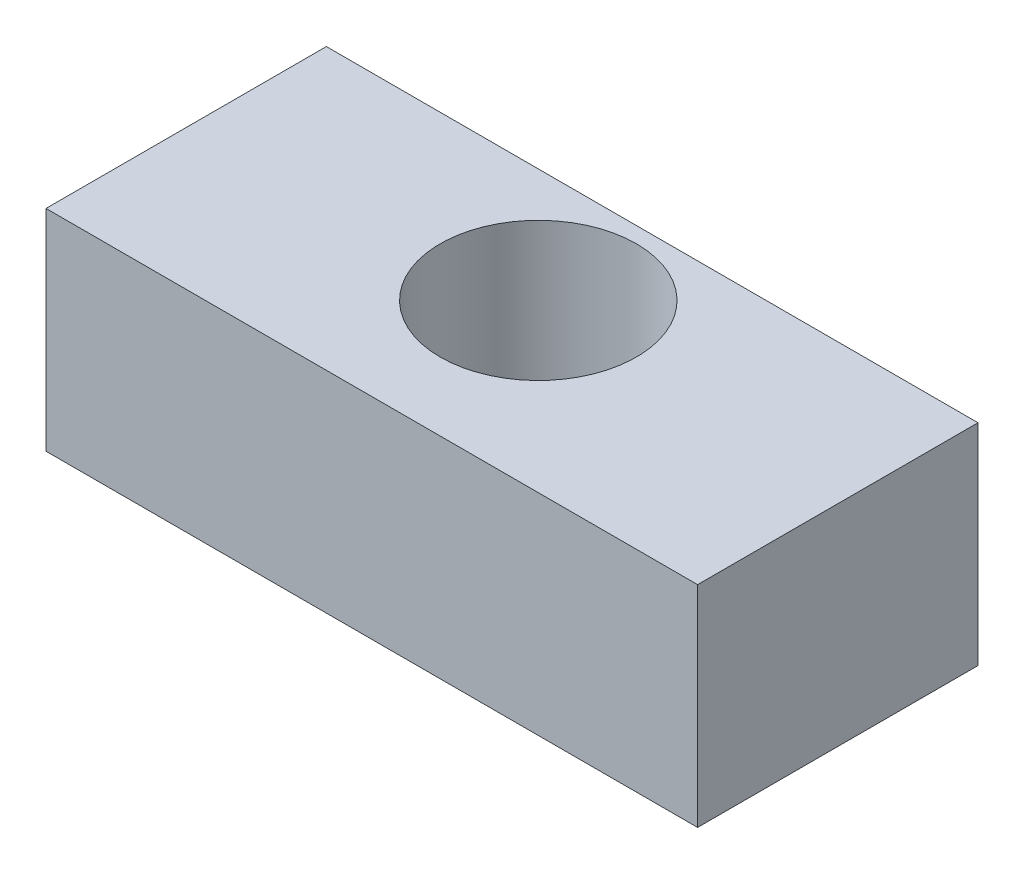
ISO-10303-21;
HEADER;
FILE_DESCRIPTION(('STEP AP214'),'2;1');
FILE_NAME('part.step','',(''),(''),'','','');
FILE_SCHEMA(('AUTOMOTIVE_DESIGN { 1 0 10303 214 1 1 1 1 }'));
ENDSEC;
DATA;
#1=APPLICATION_CONTEXT('core data for automotive mechanical design processes');
#2=APPLICATION_PROTOCOL_DEFINITION('international standard','automotive_design',2000,#1);
#3=PRODUCT_CONTEXT('',#1,'mechanical');
#4=PRODUCT('Part','Part','',(#3));
#5=PRODUCT_RELATED_PRODUCT_CATEGORY('part','',(#4));
#6=PRODUCT_DEFINITION_FORMATION('','',#4);
#7=PRODUCT_DEFINITION_CONTEXT('part definition',#1,'design');
#8=PRODUCT_DEFINITION('design','',#6,#7);
#9=PRODUCT_DEFINITION_SHAPE('','',#8);
#10=(LENGTH_UNIT() NAMED_UNIT(*) SI_UNIT(.MILLI.,.METRE.));
#11=(NAMED_UNIT(*) PLANE_ANGLE_UNIT() SI_UNIT($,.RADIAN.));
#12=(NAMED_UNIT(*) SI_UNIT($,.STERADIAN.) SOLID_ANGLE_UNIT());
#13=UNCERTAINTY_MEASURE_WITH_UNIT(LENGTH_MEASURE(1.E-05),#10,'distance_accuracy_value','');
#14=(GEOMETRIC_REPRESENTATION_CONTEXT(3) GLOBAL_UNCERTAINTY_ASSIGNED_CONTEXT((#13)) GLOBAL_UNIT_ASSIGNED_CONTEXT((#10,
#11,#12)) REPRESENTATION_CONTEXT('',''));
#15=CARTESIAN_POINT('',(0.,0.,0.));
#16=DIRECTION('',(0.,0.,1.));
#17=DIRECTION('',(1.,0.,0.));
#18=AXIS2_PLACEMENT_3D('',#15,#16,#17);
#19=CARTESIAN_POINT('',(0.,9.525,0.));
#20=DIRECTION('',(0.,-1.,0.));
#21=DIRECTION('',(0.,0.,-1.));
#22=AXIS2_PLACEMENT_3D('',#19,#20,#21);
#23=PLANE('',#22);
#24=DIRECTION('',(0.,0.,1.));
#25=VECTOR('',#24,1.);
#26=CARTESIAN_POINT('',(0.,9.525,0.));
#27=LINE('',#26,#25);
#28=CARTESIAN_POINT('',(0.,9.525,-12.7));
#29=VERTEX_POINT('',#28);
#30=CARTESIAN_POINT('',(0.,9.525,0.));
#31=VERTEX_POINT('',#30);
#32=EDGE_CURVE('E84',#29,#31,#27,.T.);
#33=ORIENTED_EDGE('',*,*,#32,.T.);
#34=DIRECTION('',(1.,0.,0.));
#35=VECTOR('',#34,1.);
#36=CARTESIAN_POINT('',(0.,9.525,0.));
#37=LINE('',#36,#35);
#38=CARTESIAN_POINT('',(29.5138969913182,9.525,0.));
#39=VERTEX_POINT('',#38);
#40=EDGE_CURVE('E79',#31,#39,#37,.T.);
#41=ORIENTED_EDGE('',*,*,#40,.T.);
#42=DIRECTION('',(0.,0.,-1.));
#43=VECTOR('',#42,1.);
#44=CARTESIAN_POINT('',(29.5138969913182,9.525,0.));
#45=LINE('',#44,#43);
#46=CARTESIAN_POINT('',(29.5138969913182,9.525,-12.7));
#47=VERTEX_POINT('',#46);
#48=EDGE_CURVE('E82',#39,#47,#45,.T.);
#49=ORIENTED_EDGE('',*,*,#48,.T.);
#50=DIRECTION('',(-1.,0.,0.));
#51=VECTOR('',#50,1.);
#52=CARTESIAN_POINT('',(0.,9.525,-12.7));
#53=LINE('',#52,#51);
#54=EDGE_CURVE('E49',#47,#29,#53,.T.);
#55=ORIENTED_EDGE('',*,*,#54,.T.);
#56=EDGE_LOOP('',(#33,#41,#49,#55));
#57=FACE_BOUND('',#56,.T.);
#58=CARTESIAN_POINT('',(14.7569484956591,9.525,-7.540625));
#59=DIRECTION('',(0.,1.,0.));
#60=DIRECTION('',(0.,0.,1.));
#61=AXIS2_PLACEMENT_3D('',#58,#59,#60);
#62=CIRCLE('',#61,4.44499999999999);
#63=CARTESIAN_POINT('',(14.7569484956591,9.525,-11.985625));
#64=VERTEX_POINT('',#63);
#65=EDGE_CURVE('E99',#64,#64,#62,.T.);
#66=ORIENTED_EDGE('',*,*,#65,.F.);
#67=EDGE_LOOP('',(#66));
#68=FACE_BOUND('',#67,.T.);
#69=ADVANCED_FACE('F32',(#57,#68),#23,.F.);
#70=CARTESIAN_POINT('',(0.,0.,0.));
#71=DIRECTION('',(0.,-1.,0.));
#72=DIRECTION('',(0.,0.,-1.));
#73=AXIS2_PLACEMENT_3D('',#70,#71,#72);
#74=PLANE('',#73);
#75=DIRECTION('',(0.,0.,1.));
#76=VECTOR('',#75,1.);
#77=CARTESIAN_POINT('',(0.,0.,0.));
#78=LINE('',#77,#76);
#79=CARTESIAN_POINT('',(0.,0.,-12.7));
#80=VERTEX_POINT('',#79);
#81=CARTESIAN_POINT('',(0.,0.,0.));
#82=VERTEX_POINT('',#81);
#83=EDGE_CURVE('E96',#80,#82,#78,.T.);
#84=ORIENTED_EDGE('',*,*,#83,.F.);
#85=DIRECTION('',(-1.,0.,0.));
#86=VECTOR('',#85,1.);
#87=CARTESIAN_POINT('',(0.,0.,-12.7));
#88=LINE('',#87,#86);
#89=CARTESIAN_POINT('',(29.5138969913182,0.,-12.7));
#90=VERTEX_POINT('',#89);
#91=EDGE_CURVE('E72',#90,#80,#88,.T.);
#92=ORIENTED_EDGE('',*,*,#91,.F.);
#93=DIRECTION('',(0.,0.,-1.));
#94=VECTOR('',#93,1.);
#95=CARTESIAN_POINT('',(29.5138969913182,0.,0.));
#96=LINE('',#95,#94);
#97=CARTESIAN_POINT('',(29.5138969913182,0.,0.));
#98=VERTEX_POINT('',#97);
#99=EDGE_CURVE('E66',#98,#90,#96,.T.);
#100=ORIENTED_EDGE('',*,*,#99,.F.);
#101=DIRECTION('',(1.,0.,0.));
#102=VECTOR('',#101,1.);
#103=CARTESIAN_POINT('',(0.,0.,0.));
#104=LINE('',#103,#102);
#105=EDGE_CURVE('E88',#82,#98,#104,.T.);
#106=ORIENTED_EDGE('',*,*,#105,.F.);
#107=EDGE_LOOP('',(#84,#92,#100,#106));
#108=FACE_BOUND('',#107,.T.);
#109=CARTESIAN_POINT('',(14.7569484956591,0.,-7.540625));
#110=DIRECTION('',(0.,1.,0.));
#111=DIRECTION('',(0.,0.,1.));
#112=AXIS2_PLACEMENT_3D('',#109,#110,#111);
#113=CIRCLE('',#112,4.44499999999999);
#114=CARTESIAN_POINT('',(14.7569484956591,0.,-11.985625));
#115=VERTEX_POINT('',#114);
#116=EDGE_CURVE('E111',#115,#115,#113,.T.);
#117=ORIENTED_EDGE('',*,*,#116,.T.);
#118=EDGE_LOOP('',(#117));
#119=FACE_BOUND('',#118,.T.);
#120=ADVANCED_FACE('F107',(#108,#119),#74,.T.);
#121=CARTESIAN_POINT('',(0.,9.525,0.));
#122=DIRECTION('',(1.,0.,0.));
#123=DIRECTION('',(0.,0.,-1.));
#124=AXIS2_PLACEMENT_3D('',#121,#122,#123);
#125=PLANE('',#124);
#126=ORIENTED_EDGE('',*,*,#83,.T.);
#127=DIRECTION('',(0.,-1.,0.));
#128=VECTOR('',#127,1.);
#129=CARTESIAN_POINT('',(0.,9.525,0.));
#130=LINE('',#129,#128);
#131=EDGE_CURVE('E11',#31,#82,#130,.T.);
#132=ORIENTED_EDGE('',*,*,#131,.F.);
#133=ORIENTED_EDGE('',*,*,#32,.F.);
#134=DIRECTION('',(0.,-1.,0.));
#135=VECTOR('',#134,1.);
#136=CARTESIAN_POINT('',(0.,9.525,-12.7));
#137=LINE('',#136,#135);
#138=EDGE_CURVE('E92',#29,#80,#137,.T.);
#139=ORIENTED_EDGE('',*,*,#138,.T.);
#140=EDGE_LOOP('',(#126,#132,#133,#139));
#141=FACE_BOUND('',#140,.T.);
#142=ADVANCED_FACE('F34',(#141),#125,.F.);
#143=CARTESIAN_POINT('',(0.,9.525,0.));
#144=DIRECTION('',(0.,0.,-1.));
#145=DIRECTION('',(-1.,0.,0.));
#146=AXIS2_PLACEMENT_3D('',#143,#144,#145);
#147=PLANE('',#146);
#148=ORIENTED_EDGE('',*,*,#105,.T.);
#149=DIRECTION('',(0.,-1.,0.));
#150=VECTOR('',#149,1.);
#151=CARTESIAN_POINT('',(29.5138969913182,9.525,0.));
#152=LINE('',#151,#150);
#153=EDGE_CURVE('E41',#39,#98,#152,.T.);
#154=ORIENTED_EDGE('',*,*,#153,.F.);
#155=ORIENTED_EDGE('',*,*,#40,.F.);
#156=ORIENTED_EDGE('',*,*,#131,.T.);
#157=EDGE_LOOP('',(#148,#154,#155,#156));
#158=FACE_BOUND('',#157,.T.);
#159=ADVANCED_FACE('F87',(#158),#147,.F.);
#160=CARTESIAN_POINT('',(29.5138969913182,9.525,0.));
#161=DIRECTION('',(-1.,0.,0.));
#162=DIRECTION('',(0.,0.,1.));
#163=AXIS2_PLACEMENT_3D('',#160,#161,#162);
#164=PLANE('',#163);
#165=ORIENTED_EDGE('',*,*,#99,.T.);
#166=DIRECTION('',(0.,-1.,0.));
#167=VECTOR('',#166,1.);
#168=CARTESIAN_POINT('',(29.5138969913182,9.525,-12.7));
#169=LINE('',#168,#167);
#170=EDGE_CURVE('E89',#47,#90,#169,.T.);
#171=ORIENTED_EDGE('',*,*,#170,.F.);
#172=ORIENTED_EDGE('',*,*,#48,.F.);
#173=ORIENTED_EDGE('',*,*,#153,.T.);
#174=EDGE_LOOP('',(#165,#171,#172,#173));
#175=FACE_BOUND('',#174,.T.);
#176=ADVANCED_FACE('F90',(#175),#164,.F.);
#177=CARTESIAN_POINT('',(0.,9.525,-12.7));
#178=DIRECTION('',(0.,0.,1.));
#179=DIRECTION('',(1.,0.,0.));
#180=AXIS2_PLACEMENT_3D('',#177,#178,#179);
#181=PLANE('',#180);
#182=ORIENTED_EDGE('',*,*,#91,.T.);
#183=ORIENTED_EDGE('',*,*,#138,.F.);
#184=ORIENTED_EDGE('',*,*,#54,.F.);
#185=ORIENTED_EDGE('',*,*,#170,.T.);
#186=EDGE_LOOP('',(#182,#183,#184,#185));
#187=FACE_BOUND('',#186,.T.);
#188=ADVANCED_FACE('F104',(#187),#181,.F.);
#189=CARTESIAN_POINT('',(14.7569484956591,9.525,-7.540625));
#190=DIRECTION('',(0.,-1.,0.));
#191=DIRECTION('',(0.,0.,-1.));
#192=AXIS2_PLACEMENT_3D('',#189,#190,#191);
#193=CYLINDRICAL_SURFACE('',#192,4.44499999999999);
#194=CARTESIAN_POINT('',(14.7569484956591,9.525,-11.985625));
#195=CARTESIAN_POINT('',(14.7569484956591,9.42578125,-11.985625));
#196=CARTESIAN_POINT('',(14.7569484956591,9.3265625,-11.985625));
#197=CARTESIAN_POINT('',(14.7569484956591,9.128125,-11.985625));
#198=CARTESIAN_POINT('',(14.7569484956591,9.02890625,-11.985625));
#199=CARTESIAN_POINT('',(14.7569484956591,8.83046875,-11.985625));
#200=CARTESIAN_POINT('',(14.7569484956591,8.73125,-11.985625));
#201=CARTESIAN_POINT('',(14.7569484956591,8.5328125,-11.985625));
#202=CARTESIAN_POINT('',(14.7569484956591,8.43359375,-11.985625));
#203=CARTESIAN_POINT('',(14.7569484956591,8.23515625,-11.985625));
#204=CARTESIAN_POINT('',(14.7569484956591,8.1359375,-11.985625));
#205=CARTESIAN_POINT('',(14.7569484956591,7.9375,-11.985625));
#206=CARTESIAN_POINT('',(14.7569484956591,7.83828125,-11.985625));
#207=CARTESIAN_POINT('',(14.7569484956591,7.63984375,-11.985625));
#208=CARTESIAN_POINT('',(14.7569484956591,7.540625,-11.985625));
#209=CARTESIAN_POINT('',(14.7569484956591,7.3421875,-11.985625));
#210=CARTESIAN_POINT('',(14.7569484956591,7.24296875,-11.985625));
#211=CARTESIAN_POINT('',(14.7569484956591,7.04453125,-11.985625));
#212=CARTESIAN_POINT('',(14.7569484956591,6.9453125,-11.985625));
#213=CARTESIAN_POINT('',(14.7569484956591,6.746875,-11.985625));
#214=CARTESIAN_POINT('',(14.7569484956591,6.64765625,-11.985625));
#215=CARTESIAN_POINT('',(14.7569484956591,6.44921875,-11.985625));
#216=CARTESIAN_POINT('',(14.7569484956591,6.35,-11.985625));
#217=CARTESIAN_POINT('',(14.7569484956591,6.1515625,-11.985625));
#218=CARTESIAN_POINT('',(14.7569484956591,6.05234375,-11.985625));
#219=CARTESIAN_POINT('',(14.7569484956591,5.85390625,-11.985625));
#220=CARTESIAN_POINT('',(14.7569484956591,5.7546875,-11.985625));
#221=CARTESIAN_POINT('',(14.7569484956591,5.55625,-11.985625));
#222=CARTESIAN_POINT('',(14.7569484956591,5.45703125,-11.985625));
#223=CARTESIAN_POINT('',(14.7569484956591,5.25859375,-11.985625));
#224=CARTESIAN_POINT('',(14.7569484956591,5.159375,-11.985625));
#225=CARTESIAN_POINT('',(14.7569484956591,4.9609375,-11.985625));
#226=CARTESIAN_POINT('',(14.7569484956591,4.86171875,-11.985625));
#227=CARTESIAN_POINT('',(14.7569484956591,4.66328125,-11.985625));
#228=CARTESIAN_POINT('',(14.7569484956591,4.5640625,-11.985625));
#229=CARTESIAN_POINT('',(14.7569484956591,4.365625,-11.985625));
#230=CARTESIAN_POINT('',(14.7569484956591,4.26640625,-11.985625));
#231=CARTESIAN_POINT('',(14.7569484956591,4.06796875,-11.985625));
#232=CARTESIAN_POINT('',(14.7569484956591,3.96875,-11.985625));
#233=CARTESIAN_POINT('',(14.7569484956591,3.7703125,-11.985625));
#234=CARTESIAN_POINT('',(14.7569484956591,3.67109375,-11.985625));
#235=CARTESIAN_POINT('',(14.7569484956591,3.47265625,-11.985625));
#236=CARTESIAN_POINT('',(14.7569484956591,3.3734375,-11.985625));
#237=CARTESIAN_POINT('',(14.7569484956591,3.175,-11.985625));
#238=CARTESIAN_POINT('',(14.7569484956591,3.07578125,-11.985625));
#239=CARTESIAN_POINT('',(14.7569484956591,2.87734375,-11.985625));
#240=CARTESIAN_POINT('',(14.7569484956591,2.778125,-11.985625));
#241=CARTESIAN_POINT('',(14.7569484956591,2.5796875,-11.985625));
#242=CARTESIAN_POINT('',(14.7569484956591,2.48046875,-11.985625));
#243=CARTESIAN_POINT('',(14.7569484956591,2.28203125,-11.985625));
#244=CARTESIAN_POINT('',(14.7569484956591,2.1828125,-11.985625));
#245=CARTESIAN_POINT('',(14.7569484956591,1.984375,-11.985625));
#246=CARTESIAN_POINT('',(14.7569484956591,1.88515625,-11.985625));
#247=CARTESIAN_POINT('',(14.7569484956591,1.68671875,-11.985625));
#248=CARTESIAN_POINT('',(14.7569484956591,1.5875,-11.985625));
#249=CARTESIAN_POINT('',(14.7569484956591,1.3890625,-11.985625));
#250=CARTESIAN_POINT('',(14.7569484956591,1.28984375,-11.985625));
#251=CARTESIAN_POINT('',(14.7569484956591,1.09140625,-11.985625));
#252=CARTESIAN_POINT('',(14.7569484956591,0.992187500000001,-11.985625));
#253=CARTESIAN_POINT('',(14.7569484956591,0.793750000000001,-11.985625));
#254=CARTESIAN_POINT('',(14.7569484956591,0.69453125,-11.985625));
#255=CARTESIAN_POINT('',(14.7569484956591,0.49609375,-11.985625));
#256=CARTESIAN_POINT('',(14.7569484956591,0.396875,-11.985625));
#257=CARTESIAN_POINT('',(14.7569484956591,0.1984375,-11.985625));
#258=CARTESIAN_POINT('',(14.7569484956591,0.0992187500000001,-11.985625));
#259=CARTESIAN_POINT('',(14.7569484956591,0.,-11.985625));
#260=B_SPLINE_CURVE_WITH_KNOTS('',3,(#194,#195,#196,#197,#198,#199,#200,#201,#202,#203,#204,
#205,#206,#207,#208,#209,#210,#211,#212,#213,#214,#215,#216,#217,#218,#219,#220,#221,#222,#223,
#224,#225,#226,#227,#228,#229,#230,#231,#232,#233,#234,#235,#236,#237,#238,#239,#240,#241,#242,
#243,#244,#245,#246,#247,#248,#249,#250,#251,#252,#253,#254,#255,#256,#257,#258,#259),
.UNSPECIFIED.,.F.,.F.,(4,2,2,2,2,2,2,2,2,2,2,2,2,2,2,2,2,2,2,2,2,2,2,2,2,2,2,2,2,2,2,2,4),(0.,
0.29765625,0.5953125,0.892968750000001,1.190625,1.48828125,1.7859375,2.08359375,2.38125,
2.67890625,2.9765625,3.27421875,3.571875,3.86953125,4.1671875,4.46484375,4.7625,5.06015625,
5.3578125,5.65546875,5.953125,6.25078125,6.5484375,6.84609375,7.14375,7.44140625,7.7390625,
8.03671875,8.334375,8.63203125,8.9296875,9.22734375,9.525),.UNSPECIFIED.);
#261=EDGE_CURVE('BSEAM117',#64,#115,#260,.T.);
#262=ORIENTED_EDGE('',*,*,#65,.T.);
#263=ORIENTED_EDGE('',*,*,#116,.F.);
#264=ORIENTED_EDGE('',*,*,#261,.T.);
#265=ORIENTED_EDGE('',*,*,#261,.F.);
#266=EDGE_LOOP('',(#262,#264,#263,#265));
#267=FACE_BOUND('',#266,.T.);
#268=ADVANCED_FACE('F117',(#267),#193,.F.);
#269=CLOSED_SHELL('',(#69,#120,#142,#159,#176,#188,#268));
#270=MANIFOLD_SOLID_BREP('B2',#269);
#271=ADVANCED_BREP_SHAPE_REPRESENTATION('',(#18,#270),#14);
#272=SHAPE_DEFINITION_REPRESENTATION(#9,#271);
ENDSEC;
END-ISO-10303-21;
